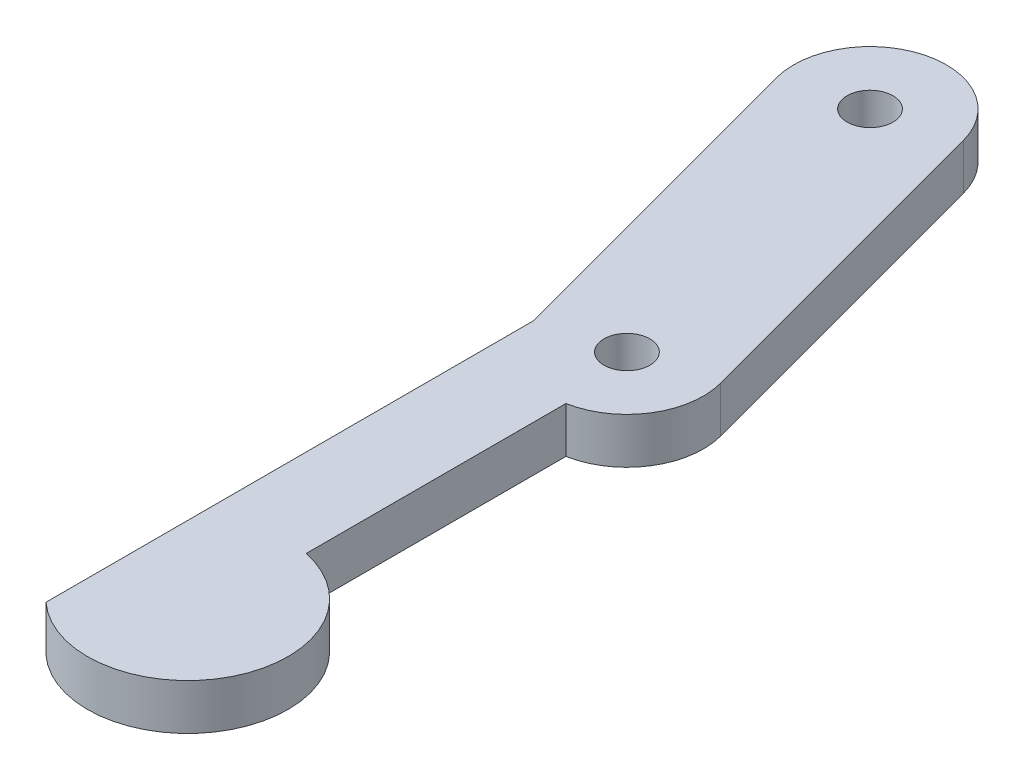
ISO-10303-21;
HEADER;
FILE_DESCRIPTION(('STEP AP214'),'2;1');
FILE_NAME('part.step','',(''),(''),'','','');
FILE_SCHEMA(('AUTOMOTIVE_DESIGN { 1 0 10303 214 1 1 1 1 }'));
ENDSEC;
DATA;
#1=APPLICATION_CONTEXT('core data for automotive mechanical design processes');
#2=APPLICATION_PROTOCOL_DEFINITION('international standard','automotive_design',2000,#1);
#3=PRODUCT_CONTEXT('',#1,'mechanical');
#4=PRODUCT('Part','Part','',(#3));
#5=PRODUCT_RELATED_PRODUCT_CATEGORY('part','',(#4));
#6=PRODUCT_DEFINITION_FORMATION('','',#4);
#7=PRODUCT_DEFINITION_CONTEXT('part definition',#1,'design');
#8=PRODUCT_DEFINITION('design','',#6,#7);
#9=PRODUCT_DEFINITION_SHAPE('','',#8);
#10=(LENGTH_UNIT() NAMED_UNIT(*) SI_UNIT(.MILLI.,.METRE.));
#11=(NAMED_UNIT(*) PLANE_ANGLE_UNIT() SI_UNIT($,.RADIAN.));
#12=(NAMED_UNIT(*) SI_UNIT($,.STERADIAN.) SOLID_ANGLE_UNIT());
#13=UNCERTAINTY_MEASURE_WITH_UNIT(LENGTH_MEASURE(1.E-05),#10,'distance_accuracy_value','');
#14=(GEOMETRIC_REPRESENTATION_CONTEXT(3) GLOBAL_UNCERTAINTY_ASSIGNED_CONTEXT((#13)) GLOBAL_UNIT_ASSIGNED_CONTEXT((#10,
#11,#12)) REPRESENTATION_CONTEXT('',''));
#15=CARTESIAN_POINT('',(0.,0.,0.));
#16=DIRECTION('',(0.,0.,1.));
#17=DIRECTION('',(1.,0.,0.));
#18=AXIS2_PLACEMENT_3D('',#15,#16,#17);
#19=CARTESIAN_POINT('',(5.82342851480665,3.,21.7333310915041));
#20=DIRECTION('',(0.,-1.,0.));
#21=DIRECTION('',(0.,0.,-1.));
#22=AXIS2_PLACEMENT_3D('',#19,#20,#21);
#23=CYLINDRICAL_SURFACE('',#22,5.);
#24=CARTESIAN_POINT('',(5.82342851480665,0.,21.7333310915041));
#25=DIRECTION('',(0.,1.,0.));
#26=DIRECTION('',(0.,0.,1.));
#27=AXIS2_PLACEMENT_3D('',#24,#25,#26);
#28=CIRCLE('',#27,5.);
#29=CARTESIAN_POINT('',(10.653057646252,0.,20.4392358659915));
#30=VERTEX_POINT('',#29);
#31=CARTESIAN_POINT('',(6.74379938336131,0.,26.6478928689483));
#32=VERTEX_POINT('',#31);
#33=EDGE_CURVE('E141',#30,#32,#28,.F.);
#34=ORIENTED_EDGE('',*,*,#33,.F.);
#35=DIRECTION('',(0.,-1.,0.));
#36=VECTOR('',#35,1.);
#37=CARTESIAN_POINT('',(10.653057646252,3.,20.4392358659915));
#38=LINE('',#37,#36);
#39=CARTESIAN_POINT('',(10.653057646252,3.,20.4392358659915));
#40=VERTEX_POINT('',#39);
#41=EDGE_CURVE('E11',#40,#30,#38,.T.);
#42=ORIENTED_EDGE('',*,*,#41,.F.);
#43=CARTESIAN_POINT('',(5.82342851480665,3.,21.7333310915041));
#44=DIRECTION('',(0.,1.,0.));
#45=DIRECTION('',(0.,0.,1.));
#46=AXIS2_PLACEMENT_3D('',#43,#44,#45);
#47=CIRCLE('',#46,5.);
#48=CARTESIAN_POINT('',(6.74379938336131,3.,26.6478928689483));
#49=VERTEX_POINT('',#48);
#50=EDGE_CURVE('E268',#40,#49,#47,.F.);
#51=ORIENTED_EDGE('',*,*,#50,.T.);
#52=DIRECTION('',(0.,-1.,0.));
#53=VECTOR('',#52,1.);
#54=CARTESIAN_POINT('',(6.74379938336131,3.,26.6478928689483));
#55=LINE('',#54,#53);
#56=EDGE_CURVE('E82',#49,#32,#55,.T.);
#57=ORIENTED_EDGE('',*,*,#56,.T.);
#58=EDGE_LOOP('',(#34,#42,#51,#57));
#59=FACE_BOUND('',#58,.T.);
#60=ADVANCED_FACE('F34',(#59),#23,.T.);
#61=CARTESIAN_POINT('',(4.82962913144535,3.,-1.29409522551259));
#62=DIRECTION('',(0.965925826289069,0.,-0.258819045102518));
#63=DIRECTION('',(-0.258819045102518,0.,-0.965925826289069));
#64=AXIS2_PLACEMENT_3D('',#61,#62,#63);
#65=PLANE('',#64);
#66=DIRECTION('',(0.258819045102518,0.,0.965925826289069));
#67=VECTOR('',#66,1.);
#68=CARTESIAN_POINT('',(4.82962913144535,0.,-1.29409522551259));
#69=LINE('',#68,#67);
#70=CARTESIAN_POINT('',(4.82962913144535,0.,-1.29409522551259));
#71=VERTEX_POINT('',#70);
#72=EDGE_CURVE('E139',#71,#30,#69,.T.);
#73=ORIENTED_EDGE('',*,*,#72,.F.);
#74=DIRECTION('',(0.,-1.,0.));
#75=VECTOR('',#74,1.);
#76=CARTESIAN_POINT('',(4.82962913144535,3.,-1.29409522551259));
#77=LINE('',#76,#75);
#78=CARTESIAN_POINT('',(4.82962913144535,3.,-1.29409522551259));
#79=VERTEX_POINT('',#78);
#80=EDGE_CURVE('E43',#79,#71,#77,.T.);
#81=ORIENTED_EDGE('',*,*,#80,.F.);
#82=DIRECTION('',(0.258819045102518,0.,0.965925826289069));
#83=VECTOR('',#82,1.);
#84=CARTESIAN_POINT('',(4.82962913144535,3.,-1.29409522551259));
#85=LINE('',#84,#83);
#86=EDGE_CURVE('E265',#79,#40,#85,.T.);
#87=ORIENTED_EDGE('',*,*,#86,.T.);
#88=ORIENTED_EDGE('',*,*,#41,.T.);
#89=EDGE_LOOP('',(#73,#81,#87,#88));
#90=FACE_BOUND('',#89,.T.);
#91=ADVANCED_FACE('F140',(#90),#65,.T.);
#92=CARTESIAN_POINT('',(0.,3.,0.));
#93=DIRECTION('',(0.,-1.,0.));
#94=DIRECTION('',(0.,0.,-1.));
#95=AXIS2_PLACEMENT_3D('',#92,#93,#94);
#96=CYLINDRICAL_SURFACE('',#95,5.);
#97=CARTESIAN_POINT('',(0.,0.,0.));
#98=DIRECTION('',(0.,1.,0.));
#99=DIRECTION('',(0.,0.,1.));
#100=AXIS2_PLACEMENT_3D('',#97,#98,#99);
#101=CIRCLE('',#100,5.);
#102=CARTESIAN_POINT('',(-4.82962913144535,0.,1.29409522551259));
#103=VERTEX_POINT('',#102);
#104=EDGE_CURVE('E132',#103,#71,#101,.F.);
#105=ORIENTED_EDGE('',*,*,#104,.F.);
#106=DIRECTION('',(0.,-1.,0.));
#107=VECTOR('',#106,1.);
#108=CARTESIAN_POINT('',(-4.82962913144535,3.,1.29409522551259));
#109=LINE('',#108,#107);
#110=CARTESIAN_POINT('',(-4.82962913144535,3.,1.29409522551259));
#111=VERTEX_POINT('',#110);
#112=EDGE_CURVE('E121',#111,#103,#109,.T.);
#113=ORIENTED_EDGE('',*,*,#112,.F.);
#114=CARTESIAN_POINT('',(0.,3.,0.));
#115=DIRECTION('',(0.,1.,0.));
#116=DIRECTION('',(0.,0.,1.));
#117=AXIS2_PLACEMENT_3D('',#114,#115,#116);
#118=CIRCLE('',#117,5.);
#119=EDGE_CURVE('E134',#111,#79,#118,.F.);
#120=ORIENTED_EDGE('',*,*,#119,.T.);
#121=ORIENTED_EDGE('',*,*,#80,.T.);
#122=EDGE_LOOP('',(#105,#113,#120,#121));
#123=FACE_BOUND('',#122,.T.);
#124=ADVANCED_FACE('F130',(#123),#96,.T.);
#125=CARTESIAN_POINT('',(-4.82962913144535,3.,1.29409522551259));
#126=DIRECTION('',(-0.965925826289069,0.,0.258819045102518));
#127=DIRECTION('',(0.258819045102518,0.,0.965925826289069));
#128=AXIS2_PLACEMENT_3D('',#125,#126,#127);
#129=PLANE('',#128);
#130=DIRECTION('',(-0.258819045102518,0.,-0.965925826289069));
#131=VECTOR('',#130,1.);
#132=CARTESIAN_POINT('',(-4.82962913144535,0.,1.29409522551259));
#133=LINE('',#132,#131);
#134=CARTESIAN_POINT('',(0.993799383361305,0.,23.0274263170166));
#135=VERTEX_POINT('',#134);
#136=EDGE_CURVE('E145',#135,#103,#133,.T.);
#137=ORIENTED_EDGE('',*,*,#136,.F.);
#138=DIRECTION('',(0.,-1.,0.));
#139=VECTOR('',#138,1.);
#140=CARTESIAN_POINT('',(0.993799383361305,3.,23.0274263170166));
#141=LINE('',#140,#139);
#142=CARTESIAN_POINT('',(0.993799383361305,3.,23.0274263170166));
#143=VERTEX_POINT('',#142);
#144=EDGE_CURVE('E119',#143,#135,#141,.T.);
#145=ORIENTED_EDGE('',*,*,#144,.F.);
#146=DIRECTION('',(-0.258819045102518,0.,-0.965925826289069));
#147=VECTOR('',#146,1.);
#148=CARTESIAN_POINT('',(-4.82962913144535,3.,1.29409522551259));
#149=LINE('',#148,#147);
#150=EDGE_CURVE('E113',#143,#111,#149,.T.);
#151=ORIENTED_EDGE('',*,*,#150,.T.);
#152=ORIENTED_EDGE('',*,*,#112,.T.);
#153=EDGE_LOOP('',(#137,#145,#151,#152));
#154=FACE_BOUND('',#153,.T.);
#155=ADVANCED_FACE('F198',(#154),#129,.T.);
#156=CARTESIAN_POINT('',(0.993799383361304,3.,0.));
#157=DIRECTION('',(1.,0.,0.));
#158=DIRECTION('',(0.,0.,-1.));
#159=AXIS2_PLACEMENT_3D('',#156,#157,#158);
#160=PLANE('',#159);
#161=DIRECTION('',(0.,0.,1.));
#162=VECTOR('',#161,1.);
#163=CARTESIAN_POINT('',(0.993799383361304,0.,0.));
#164=LINE('',#163,#162);
#165=CARTESIAN_POINT('',(0.993799383361305,0.,54.9211150617745));
#166=VERTEX_POINT('',#165);
#167=EDGE_CURVE('E118',#135,#166,#164,.T.);
#168=ORIENTED_EDGE('',*,*,#167,.T.);
#169=DIRECTION('',(0.,-1.,0.));
#170=VECTOR('',#169,1.);
#171=CARTESIAN_POINT('',(0.993799383361305,3.,54.9211150617745));
#172=LINE('',#171,#170);
#173=CARTESIAN_POINT('',(0.993799383361305,3.,54.9211150617745));
#174=VERTEX_POINT('',#173);
#175=EDGE_CURVE('E103',#174,#166,#172,.T.);
#176=ORIENTED_EDGE('',*,*,#175,.F.);
#177=DIRECTION('',(0.,0.,1.));
#178=VECTOR('',#177,1.);
#179=CARTESIAN_POINT('',(0.993799383361304,3.,0.));
#180=LINE('',#179,#178);
#181=EDGE_CURVE('E106',#143,#174,#180,.T.);
#182=ORIENTED_EDGE('',*,*,#181,.F.);
#183=ORIENTED_EDGE('',*,*,#144,.T.);
#184=EDGE_LOOP('',(#168,#176,#182,#183));
#185=FACE_BOUND('',#184,.T.);
#186=ADVANCED_FACE('F116',(#185),#160,.F.);
#187=CARTESIAN_POINT('',(5.43170728119993,3.,50.081678034927));
#188=DIRECTION('',(0.,-1.,0.));
#189=DIRECTION('',(0.,0.,-1.));
#190=AXIS2_PLACEMENT_3D('',#187,#188,#189);
#191=CYLINDRICAL_SURFACE('',#190,6.56621483402132);
#192=CARTESIAN_POINT('',(5.43170728119993,0.,50.081678034927));
#193=DIRECTION('',(0.,1.,0.));
#194=DIRECTION('',(0.,0.,1.));
#195=AXIS2_PLACEMENT_3D('',#192,#193,#194);
#196=CIRCLE('',#195,6.56621483402132);
#197=CARTESIAN_POINT('',(6.74379938336131,0.,43.6478928689483));
#198=VERTEX_POINT('',#197);
#199=EDGE_CURVE('E151',#166,#198,#196,.T.);
#200=ORIENTED_EDGE('',*,*,#199,.T.);
#201=DIRECTION('',(0.,-1.,0.));
#202=VECTOR('',#201,1.);
#203=CARTESIAN_POINT('',(6.74379938336131,3.,43.6478928689483));
#204=LINE('',#203,#202);
#205=CARTESIAN_POINT('',(6.74379938336131,3.,43.6478928689483));
#206=VERTEX_POINT('',#205);
#207=EDGE_CURVE('E105',#206,#198,#204,.T.);
#208=ORIENTED_EDGE('',*,*,#207,.F.);
#209=CARTESIAN_POINT('',(5.43170728119993,3.,50.081678034927));
#210=DIRECTION('',(0.,1.,0.));
#211=DIRECTION('',(0.,0.,1.));
#212=AXIS2_PLACEMENT_3D('',#209,#210,#211);
#213=CIRCLE('',#212,6.56621483402132);
#214=EDGE_CURVE('E98',#174,#206,#213,.T.);
#215=ORIENTED_EDGE('',*,*,#214,.F.);
#216=ORIENTED_EDGE('',*,*,#175,.T.);
#217=EDGE_LOOP('',(#200,#208,#215,#216));
#218=FACE_BOUND('',#217,.T.);
#219=ADVANCED_FACE('F101',(#218),#191,.T.);
#220=CARTESIAN_POINT('',(0.,3.,0.));
#221=DIRECTION('',(0.,-1.,0.));
#222=DIRECTION('',(0.,0.,-1.));
#223=AXIS2_PLACEMENT_3D('',#220,#221,#222);
#224=CYLINDRICAL_SURFACE('',#223,1.5);
#225=CARTESIAN_POINT('',(0.,3.,0.));
#226=DIRECTION('',(0.,1.,0.));
#227=DIRECTION('',(0.,0.,1.));
#228=AXIS2_PLACEMENT_3D('',#225,#226,#227);
#229=CIRCLE('',#228,1.5);
#230=CARTESIAN_POINT('',(0.,3.,1.5));
#231=VERTEX_POINT('',#230);
#232=EDGE_CURVE('E181',#231,#231,#229,.T.);
#233=ORIENTED_EDGE('',*,*,#232,.T.);
#234=EDGE_LOOP('',(#233));
#235=FACE_BOUND('',#234,.T.);
#236=CARTESIAN_POINT('',(0.,0.,0.));
#237=DIRECTION('',(0.,1.,0.));
#238=DIRECTION('',(0.,0.,1.));
#239=AXIS2_PLACEMENT_3D('',#236,#237,#238);
#240=CIRCLE('',#239,1.5);
#241=CARTESIAN_POINT('',(0.,0.,1.5));
#242=VERTEX_POINT('',#241);
#243=EDGE_CURVE('E159',#242,#242,#240,.T.);
#244=ORIENTED_EDGE('',*,*,#243,.F.);
#245=EDGE_LOOP('',(#244));
#246=FACE_BOUND('',#245,.T.);
#247=ADVANCED_FACE('F168',(#235,#246),#224,.F.);
#248=CARTESIAN_POINT('',(5.82342851480665,3.,21.7333310915041));
#249=DIRECTION('',(0.,-1.,0.));
#250=DIRECTION('',(0.,0.,-1.));
#251=AXIS2_PLACEMENT_3D('',#248,#249,#250);
#252=CYLINDRICAL_SURFACE('',#251,1.5);
#253=CARTESIAN_POINT('',(5.82342851480665,3.,21.7333310915041));
#254=DIRECTION('',(0.,1.,0.));
#255=DIRECTION('',(0.,0.,1.));
#256=AXIS2_PLACEMENT_3D('',#253,#254,#255);
#257=CIRCLE('',#256,1.5);
#258=CARTESIAN_POINT('',(5.82342851480665,3.,23.2333310915041));
#259=VERTEX_POINT('',#258);
#260=EDGE_CURVE('E153',#259,#259,#257,.T.);
#261=ORIENTED_EDGE('',*,*,#260,.T.);
#262=EDGE_LOOP('',(#261));
#263=FACE_BOUND('',#262,.T.);
#264=CARTESIAN_POINT('',(5.82342851480665,0.,21.7333310915041));
#265=DIRECTION('',(0.,1.,0.));
#266=DIRECTION('',(0.,0.,1.));
#267=AXIS2_PLACEMENT_3D('',#264,#265,#266);
#268=CIRCLE('',#267,1.5);
#269=CARTESIAN_POINT('',(5.82342851480665,0.,23.2333310915041));
#270=VERTEX_POINT('',#269);
#271=EDGE_CURVE('E156',#270,#270,#268,.T.);
#272=ORIENTED_EDGE('',*,*,#271,.F.);
#273=EDGE_LOOP('',(#272));
#274=FACE_BOUND('',#273,.T.);
#275=ADVANCED_FACE('F36',(#263,#274),#252,.F.);
#276=CARTESIAN_POINT('',(6.74379938336131,3.,0.));
#277=DIRECTION('',(-1.,0.,0.));
#278=DIRECTION('',(0.,0.,1.));
#279=AXIS2_PLACEMENT_3D('',#276,#277,#278);
#280=PLANE('',#279);
#281=DIRECTION('',(0.,0.,-1.));
#282=VECTOR('',#281,1.);
#283=CARTESIAN_POINT('',(6.74379938336131,0.,0.));
#284=LINE('',#283,#282);
#285=EDGE_CURVE('E75',#198,#32,#284,.T.);
#286=ORIENTED_EDGE('',*,*,#285,.T.);
#287=ORIENTED_EDGE('',*,*,#56,.F.);
#288=DIRECTION('',(0.,0.,-1.));
#289=VECTOR('',#288,1.);
#290=CARTESIAN_POINT('',(6.74379938336131,3.,0.));
#291=LINE('',#290,#289);
#292=EDGE_CURVE('E51',#206,#49,#291,.T.);
#293=ORIENTED_EDGE('',*,*,#292,.F.);
#294=ORIENTED_EDGE('',*,*,#207,.T.);
#295=EDGE_LOOP('',(#286,#287,#293,#294));
#296=FACE_BOUND('',#295,.T.);
#297=ADVANCED_FACE('F175',(#296),#280,.F.);
#298=CARTESIAN_POINT('',(0.,3.,0.));
#299=DIRECTION('',(0.,1.,0.));
#300=DIRECTION('',(0.,0.,1.));
#301=AXIS2_PLACEMENT_3D('',#298,#299,#300);
#302=PLANE('',#301);
#303=ORIENTED_EDGE('',*,*,#260,.F.);
#304=EDGE_LOOP('',(#303));
#305=FACE_BOUND('',#304,.T.);
#306=ORIENTED_EDGE('',*,*,#232,.F.);
#307=EDGE_LOOP('',(#306));
#308=FACE_BOUND('',#307,.T.);
#309=ORIENTED_EDGE('',*,*,#50,.F.);
#310=ORIENTED_EDGE('',*,*,#86,.F.);
#311=ORIENTED_EDGE('',*,*,#119,.F.);
#312=ORIENTED_EDGE('',*,*,#150,.F.);
#313=ORIENTED_EDGE('',*,*,#181,.T.);
#314=ORIENTED_EDGE('',*,*,#214,.T.);
#315=ORIENTED_EDGE('',*,*,#292,.T.);
#316=EDGE_LOOP('',(#309,#310,#311,#312,#313,#314,#315));
#317=FACE_BOUND('',#316,.T.);
#318=ADVANCED_FACE('F110',(#305,#308,#317),#302,.T.);
#319=CARTESIAN_POINT('',(0.,0.,0.));
#320=DIRECTION('',(0.,1.,0.));
#321=DIRECTION('',(0.,0.,1.));
#322=AXIS2_PLACEMENT_3D('',#319,#320,#321);
#323=PLANE('',#322);
#324=ORIENTED_EDGE('',*,*,#271,.T.);
#325=EDGE_LOOP('',(#324));
#326=FACE_BOUND('',#325,.T.);
#327=ORIENTED_EDGE('',*,*,#243,.T.);
#328=EDGE_LOOP('',(#327));
#329=FACE_BOUND('',#328,.T.);
#330=ORIENTED_EDGE('',*,*,#33,.T.);
#331=ORIENTED_EDGE('',*,*,#285,.F.);
#332=ORIENTED_EDGE('',*,*,#199,.F.);
#333=ORIENTED_EDGE('',*,*,#167,.F.);
#334=ORIENTED_EDGE('',*,*,#136,.T.);
#335=ORIENTED_EDGE('',*,*,#104,.T.);
#336=ORIENTED_EDGE('',*,*,#72,.T.);
#337=EDGE_LOOP('',(#330,#331,#332,#333,#334,#335,#336));
#338=FACE_BOUND('',#337,.T.);
#339=ADVANCED_FACE('F143',(#326,#329,#338),#323,.F.);
#340=CLOSED_SHELL('',(#60,#91,#124,#155,#186,#219,#247,#275,#297,#318,#339));
#341=MANIFOLD_SOLID_BREP('B2',#340);
#342=ADVANCED_BREP_SHAPE_REPRESENTATION('',(#18,#341),#14);
#343=SHAPE_DEFINITION_REPRESENTATION(#9,#342);
ENDSEC;
END-ISO-10303-21;
